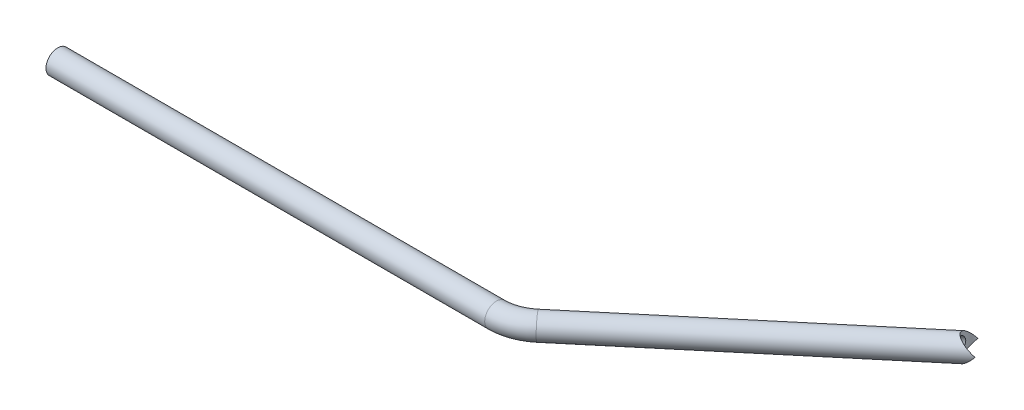
ISO-10303-21;
HEADER;
FILE_DESCRIPTION(('STEP AP214'),'2;1');
FILE_NAME('part.step','',(''),(''),'','','');
FILE_SCHEMA(('AUTOMOTIVE_DESIGN { 1 0 10303 214 1 1 1 1 }'));
ENDSEC;
DATA;
#1=APPLICATION_CONTEXT('core data for automotive mechanical design processes');
#2=APPLICATION_PROTOCOL_DEFINITION('international standard','automotive_design',2000,#1);
#3=PRODUCT_CONTEXT('',#1,'mechanical');
#4=PRODUCT('Part','Part','',(#3));
#5=PRODUCT_RELATED_PRODUCT_CATEGORY('part','',(#4));
#6=PRODUCT_DEFINITION_FORMATION('','',#4);
#7=PRODUCT_DEFINITION_CONTEXT('part definition',#1,'design');
#8=PRODUCT_DEFINITION('design','',#6,#7);
#9=PRODUCT_DEFINITION_SHAPE('','',#8);
#10=(LENGTH_UNIT() NAMED_UNIT(*) SI_UNIT(.MILLI.,.METRE.));
#11=(NAMED_UNIT(*) PLANE_ANGLE_UNIT() SI_UNIT($,.RADIAN.));
#12=(NAMED_UNIT(*) SI_UNIT($,.STERADIAN.) SOLID_ANGLE_UNIT());
#13=UNCERTAINTY_MEASURE_WITH_UNIT(LENGTH_MEASURE(1.E-05),#10,'distance_accuracy_value','');
#14=(GEOMETRIC_REPRESENTATION_CONTEXT(3) GLOBAL_UNCERTAINTY_ASSIGNED_CONTEXT((#13)) GLOBAL_UNIT_ASSIGNED_CONTEXT((#10,
#11,#12)) REPRESENTATION_CONTEXT('',''));
#15=CARTESIAN_POINT('',(0.,0.,0.));
#16=DIRECTION('',(0.,0.,1.));
#17=DIRECTION('',(1.,0.,0.));
#18=AXIS2_PLACEMENT_3D('',#15,#16,#17);
#19=CARTESIAN_POINT('',(1997.6100223762,0.,-46.7911113762046));
#20=DIRECTION('',(0.766044443118977,0.,-0.64278760968654));
#21=DIRECTION('',(-0.64278760968654,0.,-0.766044443118977));
#22=AXIS2_PLACEMENT_3D('',#19,#20,#21);
#23=CYLINDRICAL_SURFACE('',#22,50.);
#24=CARTESIAN_POINT('',(3014.42478062692,0.,-900.));
#25=DIRECTION('',(0.541675220419701,0.707106781186547,-0.454519477672044));
#26=DIRECTION('',(0.541675220419701,-0.707106781186547,-0.454519477672044));
#27=AXIS2_PLACEMENT_3D('',#24,#25,#26);
#28=ELLIPSE('',#27,70.7106781186547,50.);
#29=CARTESIAN_POINT('',(2982.28540014259,0.,-938.302222155949));
#30=VERTEX_POINT('',#29);
#31=CARTESIAN_POINT('',(3046.56416111125,0.,-861.697777844051));
#32=VERTEX_POINT('',#31);
#33=EDGE_CURVE('E55',#30,#32,#28,.T.);
#34=ORIENTED_EDGE('',*,*,#33,.F.);
#35=CARTESIAN_POINT('',(3014.42478062692,0.,-900.));
#36=DIRECTION('',(0.541675220419701,-0.707106781186547,-0.454519477672044));
#37=DIRECTION('',(0.541675220419701,0.707106781186547,-0.454519477672044));
#38=AXIS2_PLACEMENT_3D('',#35,#36,#37);
#39=ELLIPSE('',#38,70.7106781186547,50.);
#40=EDGE_CURVE('E53',#32,#30,#39,.T.);
#41=ORIENTED_EDGE('',*,*,#40,.F.);
#42=EDGE_LOOP('',(#34,#41));
#43=FACE_BOUND('',#42,.T.);
#44=CARTESIAN_POINT('',(1997.6100223762,0.,-46.7911113762046));
#45=DIRECTION('',(0.766044443118977,0.,-0.64278760968654));
#46=DIRECTION('',(-0.64278760968654,0.,-0.766044443118977));
#47=AXIS2_PLACEMENT_3D('',#44,#45,#46);
#48=CIRCLE('',#47,50.);
#49=CARTESIAN_POINT('',(2029.74940286053,0.,-8.4888892202557));
#50=VERTEX_POINT('',#49);
#51=EDGE_CURVE('E73',#50,#50,#48,.T.);
#52=ORIENTED_EDGE('',*,*,#51,.T.);
#53=EDGE_LOOP('',(#52));
#54=FACE_BOUND('',#53,.T.);
#55=ADVANCED_FACE('F33',(#43,#54),#23,.T.);
#56=CARTESIAN_POINT('',(0.,0.,0.));
#57=DIRECTION('',(1.,0.,0.));
#58=DIRECTION('',(0.,0.,-1.));
#59=AXIS2_PLACEMENT_3D('',#56,#57,#58);
#60=CYLINDRICAL_SURFACE('',#59,50.);
#61=CARTESIAN_POINT('',(1869.05250043889,0.,0.));
#62=DIRECTION('',(1.,0.,0.));
#63=DIRECTION('',(0.,0.,-1.));
#64=AXIS2_PLACEMENT_3D('',#61,#62,#63);
#65=CIRCLE('',#64,50.);
#66=CARTESIAN_POINT('',(1869.05250043889,0.,50.));
#67=VERTEX_POINT('',#66);
#68=EDGE_CURVE('E59',#67,#67,#65,.T.);
#69=ORIENTED_EDGE('',*,*,#68,.F.);
#70=EDGE_LOOP('',(#69));
#71=FACE_BOUND('',#70,.T.);
#72=CARTESIAN_POINT('',(0.,0.,0.));
#73=DIRECTION('',(1.,0.,0.));
#74=DIRECTION('',(0.,0.,-1.));
#75=AXIS2_PLACEMENT_3D('',#72,#73,#74);
#76=CIRCLE('',#75,50.);
#77=CARTESIAN_POINT('',(0.,0.,-50.));
#78=VERTEX_POINT('',#77);
#79=EDGE_CURVE('E68',#78,#78,#76,.T.);
#80=ORIENTED_EDGE('',*,*,#79,.T.);
#81=EDGE_LOOP('',(#80));
#82=FACE_BOUND('',#81,.T.);
#83=ADVANCED_FACE('F82',(#71,#82),#60,.T.);
#84=CARTESIAN_POINT('',(1869.05250043889,0.,-200.));
#85=DIRECTION('',(0.,1.,0.));
#86=DIRECTION('',(0.,0.,1.));
#87=AXIS2_PLACEMENT_3D('',#84,#85,#86);
#88=TOROIDAL_SURFACE('',#87,200.,50.);
#89=CARTESIAN_POINT('',(1869.05250043889,0.,-200.));
#90=DIRECTION('',(0.,1.,0.));
#91=DIRECTION('',(0.,0.,1.));
#92=AXIS2_PLACEMENT_3D('',#89,#90,#91);
#93=CIRCLE('',#92,250.);
#94=EDGE_CURVE('',#67,#50,#93,.T.);
#95=ORIENTED_EDGE('',*,*,#68,.T.);
#96=ORIENTED_EDGE('',*,*,#51,.F.);
#97=ORIENTED_EDGE('',*,*,#94,.T.);
#98=ORIENTED_EDGE('',*,*,#94,.F.);
#99=EDGE_LOOP('',(#95,#97,#96,#98));
#100=FACE_BOUND('',#99,.T.);
#101=ADVANCED_FACE('F78',(#100),#88,.T.);
#102=CARTESIAN_POINT('',(0.,0.,0.));
#103=DIRECTION('',(1.,0.,0.));
#104=DIRECTION('',(0.,0.,-1.));
#105=AXIS2_PLACEMENT_3D('',#102,#103,#104);
#106=PLANE('',#105);
#107=CARTESIAN_POINT('',(0.,0.,0.));
#108=DIRECTION('',(1.,0.,0.));
#109=DIRECTION('',(0.,0.,-1.));
#110=AXIS2_PLACEMENT_3D('',#107,#108,#109);
#111=CIRCLE('',#110,35.);
#112=CARTESIAN_POINT('',(0.,0.,-35.));
#113=VERTEX_POINT('',#112);
#114=EDGE_CURVE('E65',#113,#113,#111,.F.);
#115=ORIENTED_EDGE('',*,*,#114,.F.);
#116=EDGE_LOOP('',(#115));
#117=FACE_BOUND('',#116,.T.);
#118=ORIENTED_EDGE('',*,*,#79,.F.);
#119=EDGE_LOOP('',(#118));
#120=FACE_BOUND('',#119,.T.);
#121=ADVANCED_FACE('F81',(#117,#120),#106,.F.);
#122=CARTESIAN_POINT('',(0.,0.,0.));
#123=DIRECTION('',(1.,0.,0.));
#124=DIRECTION('',(0.,0.,-1.));
#125=AXIS2_PLACEMENT_3D('',#122,#123,#124);
#126=CYLINDRICAL_SURFACE('',#125,35.);
#127=CARTESIAN_POINT('',(1869.05250043889,0.,0.));
#128=DIRECTION('',(1.,0.,0.));
#129=DIRECTION('',(0.,0.,-1.));
#130=AXIS2_PLACEMENT_3D('',#127,#128,#129);
#131=CIRCLE('',#130,35.);
#132=CARTESIAN_POINT('',(1869.05250043889,0.,35.));
#133=VERTEX_POINT('',#132);
#134=EDGE_CURVE('E46',#133,#133,#131,.F.);
#135=ORIENTED_EDGE('',*,*,#134,.F.);
#136=EDGE_LOOP('',(#135));
#137=FACE_BOUND('',#136,.T.);
#138=ORIENTED_EDGE('',*,*,#114,.T.);
#139=EDGE_LOOP('',(#138));
#140=FACE_BOUND('',#139,.T.);
#141=ADVANCED_FACE('F91',(#137,#140),#126,.F.);
#142=CARTESIAN_POINT('',(1869.05250043889,0.,-200.));
#143=DIRECTION('',(0.,1.,0.));
#144=DIRECTION('',(0.,0.,1.));
#145=AXIS2_PLACEMENT_3D('',#142,#143,#144);
#146=TOROIDAL_SURFACE('',#145,200.,35.);
#147=CARTESIAN_POINT('',(1997.6100223762,0.,-46.7911113762046));
#148=DIRECTION('',(0.766044443118977,0.,-0.64278760968654));
#149=DIRECTION('',(-0.64278760968654,0.,-0.766044443118977));
#150=AXIS2_PLACEMENT_3D('',#147,#148,#149);
#151=CIRCLE('',#150,35.);
#152=CARTESIAN_POINT('',(2020.10758871523,0.,-19.9795558670403));
#153=VERTEX_POINT('',#152);
#154=EDGE_CURVE('E11',#153,#153,#151,.F.);
#155=CARTESIAN_POINT('',(1869.05250043889,0.,-200.));
#156=DIRECTION('',(0.,1.,0.));
#157=DIRECTION('',(0.,0.,1.));
#158=AXIS2_PLACEMENT_3D('',#155,#156,#157);
#159=CIRCLE('',#158,235.);
#160=EDGE_CURVE('',#133,#153,#159,.T.);
#161=ORIENTED_EDGE('',*,*,#134,.T.);
#162=ORIENTED_EDGE('',*,*,#154,.F.);
#163=ORIENTED_EDGE('',*,*,#160,.T.);
#164=ORIENTED_EDGE('',*,*,#160,.F.);
#165=EDGE_LOOP('',(#161,#163,#162,#164));
#166=FACE_BOUND('',#165,.T.);
#167=ADVANCED_FACE('F97',(#166),#146,.F.);
#168=CARTESIAN_POINT('',(1997.6100223762,0.,-46.7911113762046));
#169=DIRECTION('',(0.766044443118977,0.,-0.64278760968654));
#170=DIRECTION('',(-0.64278760968654,0.,-0.766044443118977));
#171=AXIS2_PLACEMENT_3D('',#168,#169,#170);
#172=CYLINDRICAL_SURFACE('',#171,35.);
#173=CARTESIAN_POINT('',(2964.57395646981,0.,-903.859446962511));
#174=CARTESIAN_POINT('',(2964.57395289206,-0.840107969640406,-903.8594379197));
#175=CARTESIAN_POINT('',(2964.57062078817,-1.68027595587627,-903.817073120816));
#176=CARTESIAN_POINT('',(2964.55805824322,-3.35221612686097,-903.649227751819));
#177=CARTESIAN_POINT('',(2964.54882705284,-4.18398723136081,-903.523736622524));
#178=CARTESIAN_POINT('',(2964.52662040842,-5.83320919168845,-903.193868328281));
#179=CARTESIAN_POINT('',(2964.51363781634,-6.65062956617838,-902.989340521979));
#180=CARTESIAN_POINT('',(2964.48713677192,-8.2637282566324,-902.507913468957));
#181=CARTESIAN_POINT('',(2964.47361829779,-9.05940568562161,-902.231011274672));
#182=CARTESIAN_POINT('',(2964.44995595585,-10.6160962668867,-901.615693520562));
#183=CARTESIAN_POINT('',(2964.43977568384,-11.377399510945,-901.27800836053));
#184=CARTESIAN_POINT('',(2964.42642508515,-12.8722697515329,-900.546169856211));
#185=CARTESIAN_POINT('',(2964.42325461913,-13.6058372991277,-900.152017634583));
#186=CARTESIAN_POINT('',(2964.42773315529,-15.0436443658859,-899.313845588367));
#187=CARTESIAN_POINT('',(2964.43538080077,-15.7478875512386,-898.869832023359));
#188=CARTESIAN_POINT('',(2964.46515229198,-17.1262102767459,-897.93771285958));
#189=CARTESIAN_POINT('',(2964.48727717535,-17.8002876510773,-897.449604102467));
#190=CARTESIAN_POINT('',(2964.55493631262,-19.2329409336999,-896.345460619196));
#191=CARTESIAN_POINT('',(2964.60389210542,-19.9856365330461,-895.721993968674));
#192=CARTESIAN_POINT('',(2964.73192291488,-21.4471112794062,-894.428421744554));
#193=CARTESIAN_POINT('',(2964.81100017594,-22.1558871493288,-893.758312698614));
#194=CARTESIAN_POINT('',(2965.00438204924,-23.5287326231607,-892.376933978967));
#195=CARTESIAN_POINT('',(2965.11872787512,-24.1927488103879,-891.665616945007));
#196=CARTESIAN_POINT('',(2965.38732718671,-25.4730222520025,-890.208302676231));
#197=CARTESIAN_POINT('',(2965.54158342532,-26.0892762080667,-889.462303052016));
#198=CARTESIAN_POINT('',(2965.92390210542,-27.3698937944522,-887.814170670346));
#199=CARTESIAN_POINT('',(2966.15998461763,-28.0251298541144,-886.906754232362));
#200=CARTESIAN_POINT('',(2966.69891832724,-29.261175575932,-885.061236963843));
#201=CARTESIAN_POINT('',(2967.00178180227,-29.8419715212443,-884.12313051802));
#202=CARTESIAN_POINT('',(2967.67921188947,-30.9214761037239,-882.227487772437));
#203=CARTESIAN_POINT('',(2968.053660928,-31.4203168818842,-881.269985602651));
#204=CARTESIAN_POINT('',(2968.67188030227,-32.1018921667806,-879.827087353013));
#205=CARTESIAN_POINT('',(2968.88737228968,-32.317965536588,-879.34502460308));
#206=CARTESIAN_POINT('',(2969.33751276589,-32.7270090161536,-878.380064823646));
#207=CARTESIAN_POINT('',(2969.57215950848,-32.9199812279546,-877.897167874114));
#208=CARTESIAN_POINT('',(2970.17347343994,-33.3653351294198,-876.70952934483));
#209=CARTESIAN_POINT('',(2970.55112944307,-33.6040865614513,-876.005157043568));
#210=CARTESIAN_POINT('',(2971.34735381072,-34.0273736921217,-874.603446593987));
#211=CARTESIAN_POINT('',(2971.76591492589,-34.2119189742273,-873.906107223346));
#212=CARTESIAN_POINT('',(2972.64256923607,-34.5243655933765,-872.524269852097));
#213=CARTESIAN_POINT('',(2973.10063684285,-34.6523032706249,-871.839763883977));
#214=CARTESIAN_POINT('',(2974.05439632531,-34.849900859634,-870.488717314651));
#215=CARTESIAN_POINT('',(2974.55008947779,-34.9195587927501,-869.822177324146));
#216=CARTESIAN_POINT('',(2975.57699177888,-34.9996360491842,-868.511209783695));
#217=CARTESIAN_POINT('',(2976.10826838116,-35.0099394464219,-867.866827948123));
#218=CARTESIAN_POINT('',(2977.20149804686,-34.9708402171738,-866.606540842328));
#219=CARTESIAN_POINT('',(2977.76345099515,-34.9214378147871,-865.990635465232));
#220=CARTESIAN_POINT('',(2978.91353070771,-34.7636530151838,-864.791456726835));
#221=CARTESIAN_POINT('',(2979.50166353348,-34.655256893109,-864.208190993968));
#222=CARTESIAN_POINT('',(2980.69891004008,-34.38104076593,-863.077872993232));
#223=CARTESIAN_POINT('',(2981.30802373694,-34.2152207169175,-862.530820753054));
#224=CARTESIAN_POINT('',(2982.52779237179,-33.8328374554661,-861.487515123733));
#225=CARTESIAN_POINT('',(2983.13809137647,-33.6175256222774,-860.990384261147));
#226=CARTESIAN_POINT('',(2984.36878050905,-33.1367465419106,-860.034464830104));
#227=CARTESIAN_POINT('',(2984.98917041296,-32.8712804066383,-859.575675411954));
#228=CARTESIAN_POINT('',(2986.23536480786,-32.2929262141355,-858.696995164325));
#229=CARTESIAN_POINT('',(2986.86116966295,-31.9800349443154,-858.277106973131));
#230=CARTESIAN_POINT('',(2988.11369038197,-31.3096561009203,-857.476133031817));
#231=CARTESIAN_POINT('',(2988.74040629786,-30.952165876509,-857.095049590589));
#232=CARTESIAN_POINT('',(2990.06069417242,-30.1528495944226,-856.330369111721));
#233=CARTESIAN_POINT('',(2990.75387770637,-29.7060614409083,-855.951287499146));
#234=CARTESIAN_POINT('',(2992.13073326365,-28.7641961243087,-855.238671709142));
#235=CARTESIAN_POINT('',(2992.81440468146,-28.2691159030153,-854.905140419509));
#236=CARTESIAN_POINT('',(2994.16773628152,-27.233262505839,-854.281209071791));
#237=CARTESIAN_POINT('',(2994.83738278106,-26.6924470851893,-853.99084958868));
#238=CARTESIAN_POINT('',(2996.15702823744,-25.5681155096854,-853.451127524744));
#239=CARTESIAN_POINT('',(2996.80702622066,-24.9845972437006,-853.201766972793));
#240=CARTESIAN_POINT('',(2998.19636222391,-23.6690082982131,-852.700139611031));
#241=CARTESIAN_POINT('',(2998.9309141507,-22.9290228122701,-852.455313032295));
#242=CARTESIAN_POINT('',(3000.35722266768,-21.3950999291501,-852.01394748852));
#243=CARTESIAN_POINT('',(3001.04897063283,-20.6011517256231,-851.81741823189));
#244=CARTESIAN_POINT('',(3002.37980760291,-18.9613586582525,-851.467620201847));
#245=CARTESIAN_POINT('',(3003.01890213606,-18.1155192589187,-851.314346882765));
#246=CARTESIAN_POINT('',(3004.23319189882,-16.3735348092676,-851.045756507659));
#247=CARTESIAN_POINT('',(3004.80840576373,-15.477404545275,-850.930428362873));
#248=CARTESIAN_POINT('',(3005.7574771559,-13.8499610572797,-850.755163069658));
#249=CARTESIAN_POINT('',(3006.1471150558,-13.1285437735065,-850.688583398702));
#250=CARTESIAN_POINT('',(3006.87414553951,-11.6584899525149,-850.57203794077));
#251=CARTESIAN_POINT('',(3007.21154399196,-10.9098564844772,-850.522070286857));
#252=CARTESIAN_POINT('',(3007.82632374369,-9.38878642354787,-850.436336824737));
#253=CARTESIAN_POINT('',(3008.10379901149,-8.61638930125073,-850.400548706233));
#254=CARTESIAN_POINT('',(3008.59204815441,-7.0502484785853,-850.340762838274));
#255=CARTESIAN_POINT('',(3008.802822794,-6.25650502298817,-850.316764953684));
#256=CARTESIAN_POINT('',(3009.1528018424,-4.64420789567907,-850.278395340545));
#257=CARTESIAN_POINT('',(3009.29123872352,-3.82548200533309,-850.264126372937));
#258=CARTESIAN_POINT('',(3009.43889039477,-2.59037712675806,-850.249190449804));
#259=CARTESIAN_POINT('',(3009.4781085423,-2.1774367754505,-850.245289619359));
#260=CARTESIAN_POINT('',(3009.53620028807,-1.3501291028893,-850.239546662983));
#261=CARTESIAN_POINT('',(3009.55507650803,-0.935761972429496,-850.237704271755));
#262=CARTESIAN_POINT('',(3009.57228394063,-0.106691028186624,-850.236023761935));
#263=CARTESIAN_POINT('',(3009.57061942119,0.308012697754192,-850.236185226988));
#264=CARTESIAN_POINT('',(3009.54677852659,1.13680514686272,-850.23851649468));
#265=CARTESIAN_POINT('',(3009.52460307907,1.55089389699543,-850.240686206492));
#266=CARTESIAN_POINT('',(3009.45996270073,2.37743715343341,-850.247094120261));
#267=CARTESIAN_POINT('',(3009.41749936115,2.78989178535029,-850.251332159993));
#268=CARTESIAN_POINT('',(3009.31270500598,3.61225163317337,-850.261992268863));
#269=CARTESIAN_POINT('',(3009.25037219175,4.02215661485086,-850.268414535728));
#270=CARTESIAN_POINT('',(3009.05450512135,5.13275958039222,-850.289076588569));
#271=CARTESIAN_POINT('',(3008.90203076489,5.83014671179332,-850.305614789795));
#272=CARTESIAN_POINT('',(3008.54376557037,7.21081339858514,-850.346742329826));
#273=CARTESIAN_POINT('',(3008.33796997974,7.89409169057555,-850.371332386352));
#274=CARTESIAN_POINT('',(3007.99272212563,8.90638582719712,-850.415304342535));
#275=CARTESIAN_POINT('',(3007.871474431,9.24188471101579,-850.431152907031));
#276=CARTESIAN_POINT('',(3007.61742934893,9.90825578804189,-850.465401987025));
#277=CARTESIAN_POINT('',(3007.48463490447,10.2391291353673,-850.48380185297));
#278=CARTESIAN_POINT('',(3007.06973517323,11.2247039209296,-850.543135851337));
#279=CARTESIAN_POINT('',(3006.77114666668,11.8722636876028,-850.588200313696));
#280=CARTESIAN_POINT('',(3005.98487006201,13.4471289901195,-850.715190248069));
#281=CARTESIAN_POINT('',(3005.47437124129,14.3624821169305,-850.804479138364));
#282=CARTESIAN_POINT('',(3004.38247517092,16.1460468025927,-851.015702247902));
#283=CARTESIAN_POINT('',(3003.80104944836,17.0142392257612,-851.137649601206));
#284=CARTESIAN_POINT('',(3002.57838842793,18.7030125712245,-851.41957972566));
#285=CARTESIAN_POINT('',(3001.93705629522,19.5235128045573,-851.579624749018));
#286=CARTESIAN_POINT('',(3000.60576688323,21.1137610555902,-851.942628946817));
#287=CARTESIAN_POINT('',(2999.91581523496,21.8835149307099,-852.145583157029));
#288=CARTESIAN_POINT('',(2998.48270909542,23.384588072768,-852.603513696765));
#289=CARTESIAN_POINT('',(2997.73879492975,24.1149044709444,-852.859401725847));
#290=CARTESIAN_POINT('',(2996.21820026617,25.5182947538445,-853.425557678085));
#291=CARTESIAN_POINT('',(2995.44151736322,26.1913644259956,-853.735829598015));
#292=CARTESIAN_POINT('',(2993.86466933675,27.4756407183386,-854.414720049701));
#293=CARTESIAN_POINT('',(2993.06453592193,28.0869263146641,-854.783262509899));
#294=CARTESIAN_POINT('',(2991.44819156717,29.2438607968101,-855.582786490161));
#295=CARTESIAN_POINT('',(2990.63198370722,29.7895221171088,-856.013756147305));
#296=CARTESIAN_POINT('',(2989.12435527882,30.7274970425649,-856.866335338882));
#297=CARTESIAN_POINT('',(2988.43401076038,31.1303539405204,-857.278271427256));
#298=CARTESIAN_POINT('',(2987.05371002277,31.8823772598018,-858.149191767779));
#299=CARTESIAN_POINT('',(2986.36375377291,32.2315487880215,-858.608171537902));
#300=CARTESIAN_POINT('',(2984.99045398944,32.8723150806316,-859.573222221105));
#301=CARTESIAN_POINT('',(2984.30710780946,33.1639338778228,-860.079273347746));
#302=CARTESIAN_POINT('',(2982.95305070278,33.6860995015236,-861.137825779461));
#303=CARTESIAN_POINT('',(2982.28233988558,33.916645799011,-861.690327486844));
#304=CARTESIAN_POINT('',(2980.95625372465,34.3145050274894,-862.843117341634));
#305=CARTESIAN_POINT('',(2980.30099078874,34.4814408876359,-863.443665671465));
#306=CARTESIAN_POINT('',(2979.01654548301,34.7474808375288,-864.686330141183));
#307=CARTESIAN_POINT('',(2978.38736320879,34.8465846786328,-865.328446433431));
#308=CARTESIAN_POINT('',(2977.16158959094,34.9752371825238,-866.649345425859));
#309=CARTESIAN_POINT('',(2976.56498823757,35.0048073266787,-867.328116735728));
#310=CARTESIAN_POINT('',(2975.4097946318,34.9939228964912,-868.71667668684));
#311=CARTESIAN_POINT('',(2974.85119952732,34.9534735826138,-869.426462994064));
#312=CARTESIAN_POINT('',(2973.82860614319,34.8105711222888,-870.800484576974));
#313=CARTESIAN_POINT('',(2973.3606848232,34.7144977394337,-871.462479938544));
#314=CARTESIAN_POINT('',(2972.4620300891,34.4671937596206,-872.801151444634));
#315=CARTESIAN_POINT('',(2972.03129383022,34.3159673866697,-873.47782646115));
#316=CARTESIAN_POINT('',(2971.20853557362,33.9603123439274,-874.840708653463));
#317=CARTESIAN_POINT('',(2970.81651797782,33.7558776344843,-875.526916902996));
#318=CARTESIAN_POINT('',(2970.07194762056,33.2962526672198,-876.903705855953));
#319=CARTESIAN_POINT('',(2969.71939679922,33.041059915952,-877.594286772566));
#320=CARTESIAN_POINT('',(2969.04207333454,32.4728920278152,-878.999071378824));
#321=CARTESIAN_POINT('',(2968.71870026595,32.1582105745046,-879.713258037474));
#322=CARTESIAN_POINT('',(2968.11330575213,31.4805362011759,-881.13614134853));
#323=CARTESIAN_POINT('',(2967.83128476539,31.1175427455975,-881.844837939983));
#324=CARTESIAN_POINT('',(2967.30710372331,30.3463145406763,-883.252209472353));
#325=CARTESIAN_POINT('',(2967.0649442785,29.9380790985745,-883.950884259628));
#326=CARTESIAN_POINT('',(2966.61847637628,29.0791421274557,-885.334205949254));
#327=CARTESIAN_POINT('',(2966.41417255244,28.6284354100843,-886.018851125258));
#328=CARTESIAN_POINT('',(2966.1198061793,27.8857225328787,-887.08513147258));
#329=CARTESIAN_POINT('',(2966.0178972342,27.6069328443126,-887.472806155184));
#330=CARTESIAN_POINT('',(2965.82548736575,27.0365267034806,-888.241360711174));
#331=CARTESIAN_POINT('',(2965.73498418098,26.7449128093799,-888.622241918603));
#332=CARTESIAN_POINT('',(2965.47976133922,25.8512679541409,-889.753881801785));
#333=CARTESIAN_POINT('',(2965.33133054034,25.2304393012974,-890.493628864816));
#334=CARTESIAN_POINT('',(2965.07333119347,23.9403587995717,-891.939306464403));
#335=CARTESIAN_POINT('',(2964.96384063776,23.2710129671879,-892.645166712689));
#336=CARTESIAN_POINT('',(2964.77936307389,21.8869665025471,-894.015796788211));
#337=CARTESIAN_POINT('',(2964.70437787383,21.1722634957611,-894.680564460575));
#338=CARTESIAN_POINT('',(2964.57440503681,19.5829695599556,-896.063610605739));
#339=CARTESIAN_POINT('',(2964.52442550001,18.70092296584,-896.773832417396));
#340=CARTESIAN_POINT('',(2964.45561978551,16.8797062451471,-898.119330957475));
#341=CARTESIAN_POINT('',(2964.43680237681,15.9405201165748,-898.754586543733));
#342=CARTESIAN_POINT('',(2964.42134964774,14.0097013727513,-899.934657080189));
#343=CARTESIAN_POINT('',(2964.42465949176,13.0182044454711,-900.479692178092));
#344=CARTESIAN_POINT('',(2964.44380700871,10.9845988078037,-901.464707803772));
#345=CARTESIAN_POINT('',(2964.45963600585,9.94252561611741,-901.904760809553));
#346=CARTESIAN_POINT('',(2964.48854049136,8.16673687167435,-902.536981793132));
#347=CARTESIAN_POINT('',(2964.50079630763,7.44496965137763,-902.763004758573));
#348=CARTESIAN_POINT('',(2964.52403209604,5.98528009630669,-903.154994174416));
#349=CARTESIAN_POINT('',(2964.53501233668,5.24736120057661,-903.320973280054));
#350=CARTESIAN_POINT('',(2964.55352261816,3.76095860921844,-903.588269182585));
#351=CARTESIAN_POINT('',(2964.56105793918,3.01249290688762,-903.689685033143));
#352=CARTESIAN_POINT('',(2964.57127668825,1.50936797868656,-903.825280981055));
#353=CARTESIAN_POINT('',(2964.57395968386,0.754708206842585,-903.859455086091));
#354=CARTESIAN_POINT('',(2964.57395646981,0.,-903.859446962511));
#355=B_SPLINE_CURVE_WITH_KNOTS('',3,(#173,#174,#175,#176,#177,#178,#179,#180,#181,#182,#183,
#184,#185,#186,#187,#188,#189,#190,#191,#192,#193,#194,#195,#196,#197,#198,#199,#200,#201,#202,
#203,#204,#205,#206,#207,#208,#209,#210,#211,#212,#213,#214,#215,#216,#217,#218,#219,#220,#221,
#222,#223,#224,#225,#226,#227,#228,#229,#230,#231,#232,#233,#234,#235,#236,#237,#238,#239,#240,
#241,#242,#243,#244,#245,#246,#247,#248,#249,#250,#251,#252,#253,#254,#255,#256,#257,#258,#259,
#260,#261,#262,#263,#264,#265,#266,#267,#268,#269,#270,#271,#272,#273,#274,#275,#276,#277,#278,
#279,#280,#281,#282,#283,#284,#285,#286,#287,#288,#289,#290,#291,#292,#293,#294,#295,#296,#297,
#298,#299,#300,#301,#302,#303,#304,#305,#306,#307,#308,#309,#310,#311,#312,#313,#314,#315,#316,
#317,#318,#319,#320,#321,#322,#323,#324,#325,#326,#327,#328,#329,#330,#331,#332,#333,#334,#335,
#336,#337,#338,#339,#340,#341,#342,#343,#344,#345,#346,#347,#348,#349,#350,#351,#352,#353,#354),
.UNSPECIFIED.,.T.,.F.,(4,2,2,2,2,2,2,2,2,2,2,2,2,2,2,2,2,2,2,2,2,2,2,2,2,2,2,2,2,2,2,2,2,2,2,2,
2,2,2,2,2,2,2,2,2,2,2,2,2,2,2,2,2,2,2,2,2,2,2,2,2,2,2,2,2,2,2,2,2,2,2,2,2,2,2,2,2,2,2,2,2,2,2,2,
2,2,2,2,2,2,4),(0.,2.51937866427342,5.03907741580433,7.56360250876948,10.0882304331427,
12.5843322553073,15.0803844577134,17.5761236560116,20.0720417550409,23.0051397161625,
25.9384562688946,28.8752136656239,31.8121736860625,35.2391435548816,38.6667439954377,
42.0887624993614,43.7996953865138,45.5104724722831,48.0100243114236,50.5091339717729,
53.0066369505799,55.5042247182002,58.0066889059332,60.5091437009678,63.0121809398328,
65.5152200926108,67.9608365527416,70.4063988006492,72.8521267856089,75.298000207076,
78.0183021621439,80.7387764986674,83.4617917237834,86.1849416595806,89.3946103526884,
92.6049237053705,95.8148995677446,99.0239365403013,101.489755039569,103.955296324786,
106.416942736102,108.878560932581,111.36579291849,112.60982351497,113.853693758897,
115.097305559003,116.340861117452,117.584319155705,118.827889787784,120.967607439388,
123.107515871967,124.178586002064,125.24938394007,127.391285251521,130.542393968123,
133.694771855558,136.852336572212,140.009536185202,143.226476554707,146.4436534424,
149.656664501506,152.869065797362,155.564040644994,158.258758970656,160.952349647023,
163.645963655053,166.355305307156,169.064656890468,171.773171351184,174.481482333788,
176.927676405826,179.373683170304,181.819967700968,184.266372433005,186.798189652956,
189.330034941574,191.861919003927,194.394112766983,195.858584269959,197.322764954495,
200.251155740815,203.185379115734,206.119756229403,209.516188906607,212.913577176737,
216.302549186754,219.689174688123,221.956212393576,224.222772004584,226.48584580069,
228.749121263825),.UNSPECIFIED.);
#356=CARTESIAN_POINT('',(2964.57395646981,0.,-903.859446962511));
#357=VERTEX_POINT('',#356);
#358=EDGE_CURVE('E36',#357,#357,#355,.T.);
#359=ORIENTED_EDGE('',*,*,#358,.F.);
#360=EDGE_LOOP('',(#359));
#361=FACE_BOUND('',#360,.T.);
#362=ORIENTED_EDGE('',*,*,#154,.T.);
#363=EDGE_LOOP('',(#362));
#364=FACE_BOUND('',#363,.T.);
#365=ADVANCED_FACE('F102',(#361,#364),#172,.F.);
#366=CARTESIAN_POINT('',(3014.42478062692,-50.,-900.));
#367=DIRECTION('',(0.,1.,0.));
#368=DIRECTION('',(0.,0.,1.));
#369=AXIS2_PLACEMENT_3D('',#366,#367,#368);
#370=CYLINDRICAL_SURFACE('',#369,50.);
#371=ORIENTED_EDGE('',*,*,#33,.T.);
#372=ORIENTED_EDGE('',*,*,#40,.T.);
#373=EDGE_LOOP('',(#371,#372));
#374=FACE_BOUND('',#373,.T.);
#375=ORIENTED_EDGE('',*,*,#358,.T.);
#376=EDGE_LOOP('',(#375));
#377=FACE_BOUND('',#376,.T.);
#378=ADVANCED_FACE('F56',(#374,#377),#370,.F.);
#379=CLOSED_SHELL('',(#55,#83,#101,#121,#141,#167,#365,#378));
#380=MANIFOLD_SOLID_BREP('B2',#379);
#381=ADVANCED_BREP_SHAPE_REPRESENTATION('',(#18,#380),#14);
#382=SHAPE_DEFINITION_REPRESENTATION(#9,#381);
ENDSEC;
END-ISO-10303-21;
